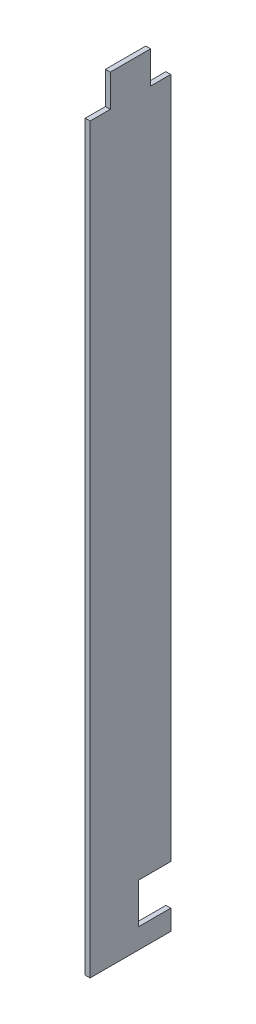
ISO-10303-21;
HEADER;
FILE_DESCRIPTION(('STEP AP214'),'2;1');
FILE_NAME('part.step','',(''),(''),'','','');
FILE_SCHEMA(('AUTOMOTIVE_DESIGN { 1 0 10303 214 1 1 1 1 }'));
ENDSEC;
DATA;
#1=APPLICATION_CONTEXT('core data for automotive mechanical design processes');
#2=APPLICATION_PROTOCOL_DEFINITION('international standard','automotive_design',2000,#1);
#3=PRODUCT_CONTEXT('',#1,'mechanical');
#4=PRODUCT('Part','Part','',(#3));
#5=PRODUCT_RELATED_PRODUCT_CATEGORY('part','',(#4));
#6=PRODUCT_DEFINITION_FORMATION('','',#4);
#7=PRODUCT_DEFINITION_CONTEXT('part definition',#1,'design');
#8=PRODUCT_DEFINITION('design','',#6,#7);
#9=PRODUCT_DEFINITION_SHAPE('','',#8);
#10=(LENGTH_UNIT() NAMED_UNIT(*) SI_UNIT(.MILLI.,.METRE.));
#11=(NAMED_UNIT(*) PLANE_ANGLE_UNIT() SI_UNIT($,.RADIAN.));
#12=(NAMED_UNIT(*) SI_UNIT($,.STERADIAN.) SOLID_ANGLE_UNIT());
#13=UNCERTAINTY_MEASURE_WITH_UNIT(LENGTH_MEASURE(1.E-05),#10,'distance_accuracy_value','');
#14=(GEOMETRIC_REPRESENTATION_CONTEXT(3) GLOBAL_UNCERTAINTY_ASSIGNED_CONTEXT((#13)) GLOBAL_UNIT_ASSIGNED_CONTEXT((#10,
#11,#12)) REPRESENTATION_CONTEXT('',''));
#15=CARTESIAN_POINT('',(0.,0.,0.));
#16=DIRECTION('',(0.,0.,1.));
#17=DIRECTION('',(1.,0.,0.));
#18=AXIS2_PLACEMENT_3D('',#15,#16,#17);
#19=CARTESIAN_POINT('',(3.,230.,-25.));
#20=DIRECTION('',(0.,-1.,0.));
#21=DIRECTION('',(0.,0.,-1.));
#22=AXIS2_PLACEMENT_3D('',#19,#20,#21);
#23=PLANE('',#22);
#24=DIRECTION('',(1.,0.,0.));
#25=VECTOR('',#24,1.);
#26=CARTESIAN_POINT('',(0.,230.,12.5));
#27=LINE('',#26,#25);
#28=CARTESIAN_POINT('',(0.,230.,12.5));
#29=VERTEX_POINT('',#28);
#30=CARTESIAN_POINT('',(3.,230.,12.5));
#31=VERTEX_POINT('',#30);
#32=EDGE_CURVE('E125',#29,#31,#27,.T.);
#33=ORIENTED_EDGE('',*,*,#32,.F.);
#34=DIRECTION('',(0.,0.,1.));
#35=VECTOR('',#34,1.);
#36=CARTESIAN_POINT('',(0.,230.,-25.));
#37=LINE('',#36,#35);
#38=CARTESIAN_POINT('',(0.,230.,25.));
#39=VERTEX_POINT('',#38);
#40=EDGE_CURVE('E138',#29,#39,#37,.T.);
#41=ORIENTED_EDGE('',*,*,#40,.T.);
#42=DIRECTION('',(-1.,0.,0.));
#43=VECTOR('',#42,1.);
#44=CARTESIAN_POINT('',(3.,230.,25.));
#45=LINE('',#44,#43);
#46=CARTESIAN_POINT('',(3.,230.,25.));
#47=VERTEX_POINT('',#46);
#48=EDGE_CURVE('E159',#47,#39,#45,.T.);
#49=ORIENTED_EDGE('',*,*,#48,.F.);
#50=DIRECTION('',(0.,0.,1.));
#51=VECTOR('',#50,1.);
#52=CARTESIAN_POINT('',(3.,230.,-25.));
#53=LINE('',#52,#51);
#54=EDGE_CURVE('E140',#31,#47,#53,.T.);
#55=ORIENTED_EDGE('',*,*,#54,.F.);
#56=EDGE_LOOP('',(#33,#41,#49,#55));
#57=FACE_BOUND('',#56,.T.);
#58=ADVANCED_FACE('F33',(#57),#23,.F.);
#59=CARTESIAN_POINT('',(3.,-230.,-25.));
#60=DIRECTION('',(0.,0.,1.));
#61=DIRECTION('',(1.,0.,0.));
#62=AXIS2_PLACEMENT_3D('',#59,#60,#61);
#63=PLANE('',#62);
#64=DIRECTION('',(1.,0.,0.));
#65=VECTOR('',#64,1.);
#66=CARTESIAN_POINT('',(0.,-217.5,-25.));
#67=LINE('',#66,#65);
#68=CARTESIAN_POINT('',(0.,-217.5,-25.));
#69=VERTEX_POINT('',#68);
#70=CARTESIAN_POINT('',(3.,-217.5,-25.));
#71=VERTEX_POINT('',#70);
#72=EDGE_CURVE('E56',#69,#71,#67,.T.);
#73=ORIENTED_EDGE('',*,*,#72,.T.);
#74=DIRECTION('',(0.,1.,0.));
#75=VECTOR('',#74,1.);
#76=CARTESIAN_POINT('',(3.,-230.,-25.));
#77=LINE('',#76,#75);
#78=CARTESIAN_POINT('',(3.,-230.,-25.));
#79=VERTEX_POINT('',#78);
#80=EDGE_CURVE('E171',#79,#71,#77,.T.);
#81=ORIENTED_EDGE('',*,*,#80,.F.);
#82=DIRECTION('',(-1.,0.,0.));
#83=VECTOR('',#82,1.);
#84=CARTESIAN_POINT('',(3.,-230.,-25.));
#85=LINE('',#84,#83);
#86=CARTESIAN_POINT('',(0.,-230.,-25.));
#87=VERTEX_POINT('',#86);
#88=EDGE_CURVE('E41',#79,#87,#85,.T.);
#89=ORIENTED_EDGE('',*,*,#88,.T.);
#90=DIRECTION('',(0.,1.,0.));
#91=VECTOR('',#90,1.);
#92=CARTESIAN_POINT('',(0.,-230.,-25.));
#93=LINE('',#92,#91);
#94=EDGE_CURVE('E150',#87,#69,#93,.T.);
#95=ORIENTED_EDGE('',*,*,#94,.T.);
#96=EDGE_LOOP('',(#73,#81,#89,#95));
#97=FACE_BOUND('',#96,.T.);
#98=ADVANCED_FACE('F169',(#97),#63,.F.);
#99=CARTESIAN_POINT('',(3.,-230.,25.));
#100=DIRECTION('',(0.,0.,-1.));
#101=DIRECTION('',(-1.,0.,0.));
#102=AXIS2_PLACEMENT_3D('',#99,#100,#101);
#103=PLANE('',#102);
#104=DIRECTION('',(0.,-1.,0.));
#105=VECTOR('',#104,1.);
#106=CARTESIAN_POINT('',(0.,-230.,25.));
#107=LINE('',#106,#105);
#108=CARTESIAN_POINT('',(0.,-230.,25.));
#109=VERTEX_POINT('',#108);
#110=EDGE_CURVE('E148',#39,#109,#107,.T.);
#111=ORIENTED_EDGE('',*,*,#110,.T.);
#112=DIRECTION('',(-1.,0.,0.));
#113=VECTOR('',#112,1.);
#114=CARTESIAN_POINT('',(3.,-230.,25.));
#115=LINE('',#114,#113);
#116=CARTESIAN_POINT('',(3.,-230.,25.));
#117=VERTEX_POINT('',#116);
#118=EDGE_CURVE('E11',#117,#109,#115,.T.);
#119=ORIENTED_EDGE('',*,*,#118,.F.);
#120=DIRECTION('',(0.,-1.,0.));
#121=VECTOR('',#120,1.);
#122=CARTESIAN_POINT('',(3.,-230.,25.));
#123=LINE('',#122,#121);
#124=EDGE_CURVE('E153',#47,#117,#123,.T.);
#125=ORIENTED_EDGE('',*,*,#124,.F.);
#126=ORIENTED_EDGE('',*,*,#48,.T.);
#127=EDGE_LOOP('',(#111,#119,#125,#126));
#128=FACE_BOUND('',#127,.T.);
#129=ADVANCED_FACE('F35',(#128),#103,.F.);
#130=CARTESIAN_POINT('',(3.,-230.,-25.));
#131=DIRECTION('',(0.,1.,0.));
#132=DIRECTION('',(0.,0.,1.));
#133=AXIS2_PLACEMENT_3D('',#130,#131,#132);
#134=PLANE('',#133);
#135=DIRECTION('',(0.,0.,-1.));
#136=VECTOR('',#135,1.);
#137=CARTESIAN_POINT('',(0.,-230.,-25.));
#138=LINE('',#137,#136);
#139=EDGE_CURVE('E173',#109,#87,#138,.T.);
#140=ORIENTED_EDGE('',*,*,#139,.T.);
#141=ORIENTED_EDGE('',*,*,#88,.F.);
#142=DIRECTION('',(0.,0.,-1.));
#143=VECTOR('',#142,1.);
#144=CARTESIAN_POINT('',(3.,-230.,-25.));
#145=LINE('',#144,#143);
#146=EDGE_CURVE('E202',#117,#79,#145,.T.);
#147=ORIENTED_EDGE('',*,*,#146,.F.);
#148=ORIENTED_EDGE('',*,*,#118,.T.);
#149=EDGE_LOOP('',(#140,#141,#147,#148));
#150=FACE_BOUND('',#149,.T.);
#151=ADVANCED_FACE('F243',(#150),#134,.F.);
#152=CARTESIAN_POINT('',(3.,-192.5,-25.));
#153=VERTEX_POINT('',#152);
#154=CARTESIAN_POINT('',(3.,230.,-25.));
#155=VERTEX_POINT('',#154);
#156=EDGE_CURVE('E204',#153,#155,#77,.T.);
#157=ORIENTED_EDGE('',*,*,#156,.F.);
#158=DIRECTION('',(1.,0.,0.));
#159=VECTOR('',#158,1.);
#160=CARTESIAN_POINT('',(0.,-192.5,-25.));
#161=LINE('',#160,#159);
#162=CARTESIAN_POINT('',(0.,-192.5,-25.));
#163=VERTEX_POINT('',#162);
#164=EDGE_CURVE('E196',#163,#153,#161,.T.);
#165=ORIENTED_EDGE('',*,*,#164,.F.);
#166=CARTESIAN_POINT('',(0.,230.,-25.));
#167=VERTEX_POINT('',#166);
#168=EDGE_CURVE('E155',#163,#167,#93,.T.);
#169=ORIENTED_EDGE('',*,*,#168,.T.);
#170=DIRECTION('',(-1.,0.,0.));
#171=VECTOR('',#170,1.);
#172=CARTESIAN_POINT('',(3.,230.,-25.));
#173=LINE('',#172,#171);
#174=EDGE_CURVE('E161',#155,#167,#173,.T.);
#175=ORIENTED_EDGE('',*,*,#174,.F.);
#176=EDGE_LOOP('',(#157,#165,#169,#175));
#177=FACE_BOUND('',#176,.T.);
#178=ADVANCED_FACE('F212',(#177),#63,.F.);
#179=CARTESIAN_POINT('',(0.,230.,-12.5));
#180=VERTEX_POINT('',#179);
#181=EDGE_CURVE('E149',#167,#180,#37,.T.);
#182=ORIENTED_EDGE('',*,*,#181,.T.);
#183=DIRECTION('',(1.,0.,0.));
#184=VECTOR('',#183,1.);
#185=CARTESIAN_POINT('',(0.,230.,-12.5));
#186=LINE('',#185,#184);
#187=CARTESIAN_POINT('',(3.,230.,-12.5));
#188=VERTEX_POINT('',#187);
#189=EDGE_CURVE('E141',#180,#188,#186,.T.);
#190=ORIENTED_EDGE('',*,*,#189,.T.);
#191=EDGE_CURVE('E162',#155,#188,#53,.T.);
#192=ORIENTED_EDGE('',*,*,#191,.F.);
#193=ORIENTED_EDGE('',*,*,#174,.T.);
#194=EDGE_LOOP('',(#182,#190,#192,#193));
#195=FACE_BOUND('',#194,.T.);
#196=ADVANCED_FACE('F216',(#195),#23,.F.);
#197=CARTESIAN_POINT('',(3.,0.,0.));
#198=DIRECTION('',(1.,0.,0.));
#199=DIRECTION('',(0.,0.,-1.));
#200=AXIS2_PLACEMENT_3D('',#197,#198,#199);
#201=PLANE('',#200);
#202=DIRECTION('',(0.,0.,1.));
#203=VECTOR('',#202,1.);
#204=CARTESIAN_POINT('',(3.,-192.5,0.));
#205=LINE('',#204,#203);
#206=CARTESIAN_POINT('',(3.,-192.5,-5.));
#207=VERTEX_POINT('',#206);
#208=EDGE_CURVE('E183',#153,#207,#205,.T.);
#209=ORIENTED_EDGE('',*,*,#208,.F.);
#210=ORIENTED_EDGE('',*,*,#156,.T.);
#211=ORIENTED_EDGE('',*,*,#191,.T.);
#212=DIRECTION('',(0.,1.,0.));
#213=VECTOR('',#212,1.);
#214=CARTESIAN_POINT('',(3.,230.,-12.5));
#215=LINE('',#214,#213);
#216=CARTESIAN_POINT('',(3.,250.,-12.5));
#217=VERTEX_POINT('',#216);
#218=EDGE_CURVE('E48',#188,#217,#215,.T.);
#219=ORIENTED_EDGE('',*,*,#218,.T.);
#220=DIRECTION('',(0.,0.,1.));
#221=VECTOR('',#220,1.);
#222=CARTESIAN_POINT('',(3.,250.,12.5));
#223=LINE('',#222,#221);
#224=CARTESIAN_POINT('',(3.,250.,12.5));
#225=VERTEX_POINT('',#224);
#226=EDGE_CURVE('E133',#217,#225,#223,.T.);
#227=ORIENTED_EDGE('',*,*,#226,.T.);
#228=DIRECTION('',(0.,-1.,0.));
#229=VECTOR('',#228,1.);
#230=CARTESIAN_POINT('',(3.,230.,12.5));
#231=LINE('',#230,#229);
#232=EDGE_CURVE('E222',#225,#31,#231,.T.);
#233=ORIENTED_EDGE('',*,*,#232,.T.);
#234=ORIENTED_EDGE('',*,*,#54,.T.);
#235=ORIENTED_EDGE('',*,*,#124,.T.);
#236=ORIENTED_EDGE('',*,*,#146,.T.);
#237=ORIENTED_EDGE('',*,*,#80,.T.);
#238=DIRECTION('',(0.,0.,1.));
#239=VECTOR('',#238,1.);
#240=CARTESIAN_POINT('',(3.,-217.5,0.));
#241=LINE('',#240,#239);
#242=CARTESIAN_POINT('',(3.,-217.5,-5.));
#243=VERTEX_POINT('',#242);
#244=EDGE_CURVE('E189',#71,#243,#241,.T.);
#245=ORIENTED_EDGE('',*,*,#244,.T.);
#246=DIRECTION('',(0.,1.,0.));
#247=VECTOR('',#246,1.);
#248=CARTESIAN_POINT('',(3.,0.,-5.00000000000001));
#249=LINE('',#248,#247);
#250=EDGE_CURVE('E186',#243,#207,#249,.T.);
#251=ORIENTED_EDGE('',*,*,#250,.T.);
#252=EDGE_LOOP('',(#209,#210,#211,#219,#227,#233,#234,#235,#236,#237,#245,#251));
#253=FACE_BOUND('',#252,.T.);
#254=ADVANCED_FACE('F232',(#253),#201,.T.);
#255=CARTESIAN_POINT('',(0.,0.,0.));
#256=DIRECTION('',(1.,0.,0.));
#257=DIRECTION('',(0.,0.,-1.));
#258=AXIS2_PLACEMENT_3D('',#255,#256,#257);
#259=PLANE('',#258);
#260=ORIENTED_EDGE('',*,*,#168,.F.);
#261=DIRECTION('',(0.,0.,1.));
#262=VECTOR('',#261,1.);
#263=CARTESIAN_POINT('',(0.,-192.5,0.));
#264=LINE('',#263,#262);
#265=CARTESIAN_POINT('',(0.,-192.5,-5.));
#266=VERTEX_POINT('',#265);
#267=EDGE_CURVE('E179',#163,#266,#264,.T.);
#268=ORIENTED_EDGE('',*,*,#267,.T.);
#269=DIRECTION('',(0.,1.,0.));
#270=VECTOR('',#269,1.);
#271=CARTESIAN_POINT('',(0.,0.,-5.00000000000001));
#272=LINE('',#271,#270);
#273=CARTESIAN_POINT('',(0.,-217.5,-5.));
#274=VERTEX_POINT('',#273);
#275=EDGE_CURVE('E177',#274,#266,#272,.T.);
#276=ORIENTED_EDGE('',*,*,#275,.F.);
#277=DIRECTION('',(0.,0.,1.));
#278=VECTOR('',#277,1.);
#279=CARTESIAN_POINT('',(0.,-217.5,0.));
#280=LINE('',#279,#278);
#281=EDGE_CURVE('E175',#69,#274,#280,.T.);
#282=ORIENTED_EDGE('',*,*,#281,.F.);
#283=ORIENTED_EDGE('',*,*,#94,.F.);
#284=ORIENTED_EDGE('',*,*,#139,.F.);
#285=ORIENTED_EDGE('',*,*,#110,.F.);
#286=ORIENTED_EDGE('',*,*,#40,.F.);
#287=DIRECTION('',(0.,-1.,0.));
#288=VECTOR('',#287,1.);
#289=CARTESIAN_POINT('',(0.,230.,12.5));
#290=LINE('',#289,#288);
#291=CARTESIAN_POINT('',(0.,250.,12.5));
#292=VERTEX_POINT('',#291);
#293=EDGE_CURVE('E121',#292,#29,#290,.T.);
#294=ORIENTED_EDGE('',*,*,#293,.F.);
#295=DIRECTION('',(0.,0.,1.));
#296=VECTOR('',#295,1.);
#297=CARTESIAN_POINT('',(0.,250.,12.5));
#298=LINE('',#297,#296);
#299=CARTESIAN_POINT('',(0.,250.,-12.5));
#300=VERTEX_POINT('',#299);
#301=EDGE_CURVE('E142',#300,#292,#298,.T.);
#302=ORIENTED_EDGE('',*,*,#301,.F.);
#303=DIRECTION('',(0.,1.,0.));
#304=VECTOR('',#303,1.);
#305=CARTESIAN_POINT('',(0.,230.,-12.5));
#306=LINE('',#305,#304);
#307=EDGE_CURVE('E132',#180,#300,#306,.T.);
#308=ORIENTED_EDGE('',*,*,#307,.F.);
#309=ORIENTED_EDGE('',*,*,#181,.F.);
#310=EDGE_LOOP('',(#260,#268,#276,#282,#283,#284,#285,#286,#294,#302,#308,#309));
#311=FACE_BOUND('',#310,.T.);
#312=ADVANCED_FACE('F146',(#311),#259,.F.);
#313=CARTESIAN_POINT('',(0.,0.,-5.00000000000001));
#314=DIRECTION('',(0.,0.,-1.));
#315=DIRECTION('',(0.,1.,0.));
#316=AXIS2_PLACEMENT_3D('',#313,#314,#315);
#317=PLANE('',#316);
#318=ORIENTED_EDGE('',*,*,#250,.F.);
#319=DIRECTION('',(1.,0.,0.));
#320=VECTOR('',#319,1.);
#321=CARTESIAN_POINT('',(0.,-217.5,-5.));
#322=LINE('',#321,#320);
#323=EDGE_CURVE('E181',#274,#243,#322,.T.);
#324=ORIENTED_EDGE('',*,*,#323,.F.);
#325=ORIENTED_EDGE('',*,*,#275,.T.);
#326=DIRECTION('',(1.,0.,0.));
#327=VECTOR('',#326,1.);
#328=CARTESIAN_POINT('',(0.,-192.5,-5.));
#329=LINE('',#328,#327);
#330=EDGE_CURVE('E194',#266,#207,#329,.T.);
#331=ORIENTED_EDGE('',*,*,#330,.T.);
#332=EDGE_LOOP('',(#318,#324,#325,#331));
#333=FACE_BOUND('',#332,.T.);
#334=ADVANCED_FACE('F239',(#333),#317,.T.);
#335=CARTESIAN_POINT('',(0.,-192.5,0.));
#336=DIRECTION('',(0.,1.,0.));
#337=DIRECTION('',(0.,0.,1.));
#338=AXIS2_PLACEMENT_3D('',#335,#336,#337);
#339=PLANE('',#338);
#340=ORIENTED_EDGE('',*,*,#208,.T.);
#341=ORIENTED_EDGE('',*,*,#330,.F.);
#342=ORIENTED_EDGE('',*,*,#267,.F.);
#343=ORIENTED_EDGE('',*,*,#164,.T.);
#344=EDGE_LOOP('',(#340,#341,#342,#343));
#345=FACE_BOUND('',#344,.T.);
#346=ADVANCED_FACE('F237',(#345),#339,.F.);
#347=CARTESIAN_POINT('',(0.,-217.5,0.));
#348=DIRECTION('',(0.,1.,0.));
#349=DIRECTION('',(0.,0.,1.));
#350=AXIS2_PLACEMENT_3D('',#347,#348,#349);
#351=PLANE('',#350);
#352=ORIENTED_EDGE('',*,*,#244,.F.);
#353=ORIENTED_EDGE('',*,*,#72,.F.);
#354=ORIENTED_EDGE('',*,*,#281,.T.);
#355=ORIENTED_EDGE('',*,*,#323,.T.);
#356=EDGE_LOOP('',(#352,#353,#354,#355));
#357=FACE_BOUND('',#356,.T.);
#358=ADVANCED_FACE('F240',(#357),#351,.T.);
#359=CARTESIAN_POINT('',(0.,230.,12.5));
#360=DIRECTION('',(0.,0.,1.));
#361=DIRECTION('',(1.,0.,0.));
#362=AXIS2_PLACEMENT_3D('',#359,#360,#361);
#363=PLANE('',#362);
#364=ORIENTED_EDGE('',*,*,#232,.F.);
#365=DIRECTION('',(1.,0.,0.));
#366=VECTOR('',#365,1.);
#367=CARTESIAN_POINT('',(0.,250.,12.5));
#368=LINE('',#367,#366);
#369=EDGE_CURVE('E127',#292,#225,#368,.T.);
#370=ORIENTED_EDGE('',*,*,#369,.F.);
#371=ORIENTED_EDGE('',*,*,#293,.T.);
#372=ORIENTED_EDGE('',*,*,#32,.T.);
#373=EDGE_LOOP('',(#364,#370,#371,#372));
#374=FACE_BOUND('',#373,.T.);
#375=ADVANCED_FACE('F124',(#374),#363,.T.);
#376=CARTESIAN_POINT('',(0.,250.,12.5));
#377=DIRECTION('',(0.,1.,0.));
#378=DIRECTION('',(0.,0.,1.));
#379=AXIS2_PLACEMENT_3D('',#376,#377,#378);
#380=PLANE('',#379);
#381=ORIENTED_EDGE('',*,*,#226,.F.);
#382=DIRECTION('',(1.,0.,0.));
#383=VECTOR('',#382,1.);
#384=CARTESIAN_POINT('',(0.,250.,-12.5));
#385=LINE('',#384,#383);
#386=EDGE_CURVE('E228',#300,#217,#385,.T.);
#387=ORIENTED_EDGE('',*,*,#386,.F.);
#388=ORIENTED_EDGE('',*,*,#301,.T.);
#389=ORIENTED_EDGE('',*,*,#369,.T.);
#390=EDGE_LOOP('',(#381,#387,#388,#389));
#391=FACE_BOUND('',#390,.T.);
#392=ADVANCED_FACE('F329',(#391),#380,.T.);
#393=CARTESIAN_POINT('',(0.,230.,-12.5));
#394=DIRECTION('',(0.,0.,-1.));
#395=DIRECTION('',(-1.,0.,0.));
#396=AXIS2_PLACEMENT_3D('',#393,#394,#395);
#397=PLANE('',#396);
#398=ORIENTED_EDGE('',*,*,#218,.F.);
#399=ORIENTED_EDGE('',*,*,#189,.F.);
#400=ORIENTED_EDGE('',*,*,#307,.T.);
#401=ORIENTED_EDGE('',*,*,#386,.T.);
#402=EDGE_LOOP('',(#398,#399,#400,#401));
#403=FACE_BOUND('',#402,.T.);
#404=ADVANCED_FACE('F337',(#403),#397,.T.);
#405=CLOSED_SHELL('',(#58,#98,#129,#151,#178,#196,#254,#312,#334,#346,#358,#375,#392,#404));
#406=MANIFOLD_SOLID_BREP('B2',#405);
#407=ADVANCED_BREP_SHAPE_REPRESENTATION('',(#18,#406),#14);
#408=SHAPE_DEFINITION_REPRESENTATION(#9,#407);
ENDSEC;
END-ISO-10303-21;
